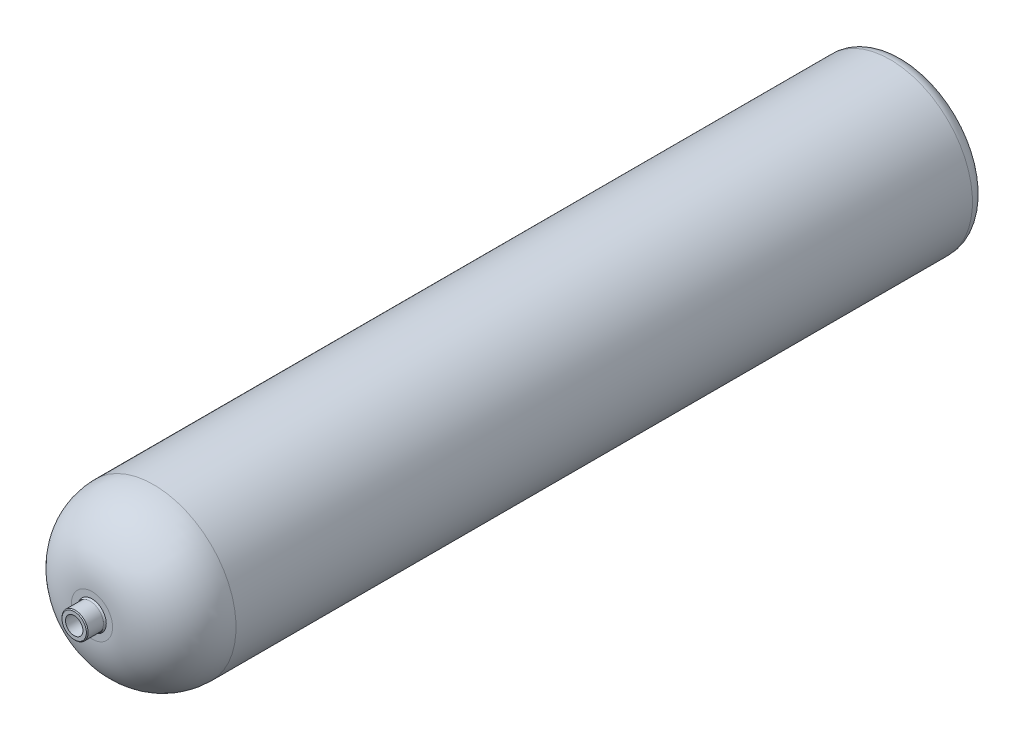
ISO-10303-21;
HEADER;
FILE_DESCRIPTION(('STEP AP214'),'2;1');
FILE_NAME('part.step','',(''),(''),'','','');
FILE_SCHEMA(('AUTOMOTIVE_DESIGN { 1 0 10303 214 1 1 1 1 }'));
ENDSEC;
DATA;
#1=APPLICATION_CONTEXT('core data for automotive mechanical design processes');
#2=APPLICATION_PROTOCOL_DEFINITION('international standard','automotive_design',2000,#1);
#3=PRODUCT_CONTEXT('',#1,'mechanical');
#4=PRODUCT('Part','Part','',(#3));
#5=PRODUCT_RELATED_PRODUCT_CATEGORY('part','',(#4));
#6=PRODUCT_DEFINITION_FORMATION('','',#4);
#7=PRODUCT_DEFINITION_CONTEXT('part definition',#1,'design');
#8=PRODUCT_DEFINITION('design','',#6,#7);
#9=PRODUCT_DEFINITION_SHAPE('','',#8);
#10=(LENGTH_UNIT() NAMED_UNIT(*) SI_UNIT(.MILLI.,.METRE.));
#11=(NAMED_UNIT(*) PLANE_ANGLE_UNIT() SI_UNIT($,.RADIAN.));
#12=(NAMED_UNIT(*) SI_UNIT($,.STERADIAN.) SOLID_ANGLE_UNIT());
#13=UNCERTAINTY_MEASURE_WITH_UNIT(LENGTH_MEASURE(1.E-05),#10,'distance_accuracy_value','');
#14=(GEOMETRIC_REPRESENTATION_CONTEXT(3) GLOBAL_UNCERTAINTY_ASSIGNED_CONTEXT((#13)) GLOBAL_UNIT_ASSIGNED_CONTEXT((#10,
#11,#12)) REPRESENTATION_CONTEXT('',''));
#15=CARTESIAN_POINT('',(0.,0.,0.));
#16=DIRECTION('',(0.,0.,1.));
#17=DIRECTION('',(1.,0.,0.));
#18=AXIS2_PLACEMENT_3D('',#15,#16,#17);
#19=CARTESIAN_POINT('',(0.,0.,329.65));
#20=DIRECTION('',(0.,0.,-1.));
#21=DIRECTION('',(-1.,0.,0.));
#22=AXIS2_PLACEMENT_3D('',#19,#20,#21);
#23=PLANE('',#22);
#24=CARTESIAN_POINT('',(0.,0.,329.65));
#25=DIRECTION('',(0.,0.,-1.));
#26=DIRECTION('',(-1.,0.,0.));
#27=AXIS2_PLACEMENT_3D('',#24,#25,#26);
#28=CIRCLE('',#27,30.);
#29=CARTESIAN_POINT('',(-30.,0.,329.65));
#30=VERTEX_POINT('',#29);
#31=EDGE_CURVE('E10',#30,#30,#28,.F.);
#32=ORIENTED_EDGE('',*,*,#31,.T.);
#33=EDGE_LOOP('',(#32));
#34=FACE_BOUND('',#33,.T.);
#35=CARTESIAN_POINT('',(0.,0.,329.65));
#36=DIRECTION('',(0.,0.,1.));
#37=DIRECTION('',(1.,0.,0.));
#38=AXIS2_PLACEMENT_3D('',#35,#36,#37);
#39=CIRCLE('',#38,20.7883652999684);
#40=CARTESIAN_POINT('',(20.7883652999684,0.,329.65));
#41=VERTEX_POINT('',#40);
#42=EDGE_CURVE('E54',#41,#41,#39,.F.);
#43=ORIENTED_EDGE('',*,*,#42,.T.);
#44=EDGE_LOOP('',(#43));
#45=FACE_BOUND('',#44,.T.);
#46=ADVANCED_FACE('F33',(#34,#45),#23,.F.);
#47=CARTESIAN_POINT('',(0.,0.,-854.));
#48=DIRECTION('',(0.,0.,1.));
#49=DIRECTION('',(1.,0.,0.));
#50=AXIS2_PLACEMENT_3D('',#47,#48,#49);
#51=CYLINDRICAL_SURFACE('',#50,120.);
#52=CARTESIAN_POINT('',(0.,0.,239.65));
#53=DIRECTION('',(0.,0.,-1.));
#54=DIRECTION('',(-1.,0.,0.));
#55=AXIS2_PLACEMENT_3D('',#52,#53,#54);
#56=CIRCLE('',#55,120.);
#57=CARTESIAN_POINT('',(-120.,0.,239.65));
#58=VERTEX_POINT('',#57);
#59=EDGE_CURVE('E40',#58,#58,#56,.T.);
#60=ORIENTED_EDGE('',*,*,#59,.T.);
#61=EDGE_LOOP('',(#60));
#62=FACE_BOUND('',#61,.T.);
#63=CARTESIAN_POINT('',(0.,0.,-834.));
#64=DIRECTION('',(0.,0.,-1.));
#65=DIRECTION('',(-1.,0.,0.));
#66=AXIS2_PLACEMENT_3D('',#63,#64,#65);
#67=CIRCLE('',#66,120.);
#68=CARTESIAN_POINT('',(-120.,0.,-834.));
#69=VERTEX_POINT('',#68);
#70=EDGE_CURVE('E44',#69,#69,#67,.F.);
#71=ORIENTED_EDGE('',*,*,#70,.T.);
#72=EDGE_LOOP('',(#71));
#73=FACE_BOUND('',#72,.T.);
#74=ADVANCED_FACE('F87',(#62,#73),#51,.T.);
#75=CARTESIAN_POINT('',(0.,0.,-854.));
#76=DIRECTION('',(0.,0.,-1.));
#77=DIRECTION('',(-1.,0.,0.));
#78=AXIS2_PLACEMENT_3D('',#75,#76,#77);
#79=PLANE('',#78);
#80=CARTESIAN_POINT('',(0.,0.,-854.));
#81=DIRECTION('',(0.,0.,-1.));
#82=DIRECTION('',(-1.,0.,0.));
#83=AXIS2_PLACEMENT_3D('',#80,#81,#82);
#84=CIRCLE('',#83,100.);
#85=CARTESIAN_POINT('',(-100.,0.,-854.));
#86=VERTEX_POINT('',#85);
#87=EDGE_CURVE('E48',#86,#86,#84,.T.);
#88=ORIENTED_EDGE('',*,*,#87,.T.);
#89=EDGE_LOOP('',(#88));
#90=FACE_BOUND('',#89,.T.);
#91=ADVANCED_FACE('F77',(#90),#79,.T.);
#92=CARTESIAN_POINT('',(0.,0.,330.2));
#93=DIRECTION('',(0.,0.,1.));
#94=DIRECTION('',(1.,0.,0.));
#95=AXIS2_PLACEMENT_3D('',#92,#93,#94);
#96=CYLINDRICAL_SURFACE('',#95,12.7);
#97=CARTESIAN_POINT('',(0.,0.,355.6));
#98=DIRECTION('',(0.,0.,1.));
#99=DIRECTION('',(1.,0.,0.));
#100=AXIS2_PLACEMENT_3D('',#97,#98,#99);
#101=CIRCLE('',#100,12.7);
#102=CARTESIAN_POINT('',(12.7,0.,355.6));
#103=VERTEX_POINT('',#102);
#104=EDGE_CURVE('E66',#103,#103,#101,.T.);
#105=ORIENTED_EDGE('',*,*,#104,.T.);
#106=EDGE_LOOP('',(#105));
#107=FACE_BOUND('',#106,.T.);
#108=CARTESIAN_POINT('',(0.,0.,329.65));
#109=DIRECTION('',(0.,0.,-1.));
#110=DIRECTION('',(-1.,0.,0.));
#111=AXIS2_PLACEMENT_3D('',#108,#109,#110);
#112=CIRCLE('',#111,12.7);
#113=CARTESIAN_POINT('',(-12.7,0.,329.65));
#114=VERTEX_POINT('',#113);
#115=EDGE_CURVE('E53',#114,#114,#112,.F.);
#116=ORIENTED_EDGE('',*,*,#115,.F.);
#117=EDGE_LOOP('',(#116));
#118=FACE_BOUND('',#117,.T.);
#119=ADVANCED_FACE('F74',(#107,#118),#96,.F.);
#120=CARTESIAN_POINT('',(0.,0.,332.060182940713));
#121=DIRECTION('',(0.,0.,-1.));
#122=DIRECTION('',(-1.,0.,0.));
#123=AXIS2_PLACEMENT_3D('',#120,#121,#122);
#124=TOROIDAL_SURFACE('',#123,21.59,2.54);
#125=CARTESIAN_POINT('',(0.,0.,332.060182940713));
#126=DIRECTION('',(0.,0.,-1.));
#127=DIRECTION('',(-1.,0.,0.));
#128=AXIS2_PLACEMENT_3D('',#125,#126,#127);
#129=CIRCLE('',#128,19.05);
#130=CARTESIAN_POINT('',(-19.05,0.,332.060182940713));
#131=VERTEX_POINT('',#130);
#132=EDGE_CURVE('E57',#131,#131,#129,.F.);
#133=ORIENTED_EDGE('',*,*,#132,.F.);
#134=EDGE_LOOP('',(#133));
#135=FACE_BOUND('',#134,.T.);
#136=ORIENTED_EDGE('',*,*,#42,.F.);
#137=EDGE_LOOP('',(#136));
#138=FACE_BOUND('',#137,.T.);
#139=ADVANCED_FACE('F76',(#135,#138),#124,.F.);
#140=CARTESIAN_POINT('',(0.,0.,355.6));
#141=DIRECTION('',(0.,0.,1.));
#142=DIRECTION('',(1.,0.,0.));
#143=AXIS2_PLACEMENT_3D('',#140,#141,#142);
#144=CYLINDRICAL_SURFACE('',#143,19.05);
#145=ORIENTED_EDGE('',*,*,#132,.T.);
#146=EDGE_LOOP('',(#145));
#147=FACE_BOUND('',#146,.T.);
#148=CARTESIAN_POINT('',(0.,0.,354.33));
#149=DIRECTION('',(0.,0.,1.));
#150=DIRECTION('',(1.,0.,0.));
#151=AXIS2_PLACEMENT_3D('',#148,#149,#150);
#152=CIRCLE('',#151,19.05);
#153=CARTESIAN_POINT('',(19.05,0.,354.33));
#154=VERTEX_POINT('',#153);
#155=EDGE_CURVE('E60',#154,#154,#152,.F.);
#156=ORIENTED_EDGE('',*,*,#155,.T.);
#157=EDGE_LOOP('',(#156));
#158=FACE_BOUND('',#157,.T.);
#159=ADVANCED_FACE('F84',(#147,#158),#144,.T.);
#160=CARTESIAN_POINT('',(0.,0.,355.6));
#161=DIRECTION('',(0.,0.,1.));
#162=DIRECTION('',(1.,0.,0.));
#163=AXIS2_PLACEMENT_3D('',#160,#161,#162);
#164=PLANE('',#163);
#165=CARTESIAN_POINT('',(0.,0.,355.6));
#166=DIRECTION('',(0.,0.,1.));
#167=DIRECTION('',(1.,0.,0.));
#168=AXIS2_PLACEMENT_3D('',#165,#166,#167);
#169=CIRCLE('',#168,17.78);
#170=CARTESIAN_POINT('',(17.78,0.,355.6));
#171=VERTEX_POINT('',#170);
#172=EDGE_CURVE('E63',#171,#171,#169,.T.);
#173=ORIENTED_EDGE('',*,*,#172,.T.);
#174=EDGE_LOOP('',(#173));
#175=FACE_BOUND('',#174,.T.);
#176=ORIENTED_EDGE('',*,*,#104,.F.);
#177=EDGE_LOOP('',(#176));
#178=FACE_BOUND('',#177,.T.);
#179=ADVANCED_FACE('F106',(#175,#178),#164,.T.);
#180=CARTESIAN_POINT('',(0.,0.,355.6));
#181=DIRECTION('',(0.,0.,-1.));
#182=DIRECTION('',(-1.,0.,0.));
#183=AXIS2_PLACEMENT_3D('',#180,#181,#182);
#184=CONICAL_SURFACE('',#183,17.78,0.785398163397422);
#185=ORIENTED_EDGE('',*,*,#155,.F.);
#186=EDGE_LOOP('',(#185));
#187=FACE_BOUND('',#186,.T.);
#188=ORIENTED_EDGE('',*,*,#172,.F.);
#189=EDGE_LOOP('',(#188));
#190=FACE_BOUND('',#189,.T.);
#191=ADVANCED_FACE('F100',(#187,#190),#184,.T.);
#192=ORIENTED_EDGE('',*,*,#115,.T.);
#193=EDGE_LOOP('',(#192));
#194=FACE_BOUND('',#193,.T.);
#195=ADVANCED_FACE('F72',(#194),#23,.F.);
#196=CARTESIAN_POINT('',(0.,0.,-834.));
#197=DIRECTION('',(0.,0.,-1.));
#198=DIRECTION('',(-1.,0.,0.));
#199=AXIS2_PLACEMENT_3D('',#196,#197,#198);
#200=TOROIDAL_SURFACE('',#199,100.,20.);
#201=ORIENTED_EDGE('',*,*,#70,.F.);
#202=EDGE_LOOP('',(#201));
#203=FACE_BOUND('',#202,.T.);
#204=ORIENTED_EDGE('',*,*,#87,.F.);
#205=EDGE_LOOP('',(#204));
#206=FACE_BOUND('',#205,.T.);
#207=ADVANCED_FACE('F99',(#203,#206),#200,.T.);
#208=CARTESIAN_POINT('',(0.,0.,239.65));
#209=DIRECTION('',(0.,0.,-1.));
#210=DIRECTION('',(-1.,0.,0.));
#211=AXIS2_PLACEMENT_3D('',#208,#209,#210);
#212=DEGENERATE_TOROIDAL_SURFACE('',#211,30.,90.,.T.);
#213=ORIENTED_EDGE('',*,*,#31,.F.);
#214=EDGE_LOOP('',(#213));
#215=FACE_BOUND('',#214,.T.);
#216=ORIENTED_EDGE('',*,*,#59,.F.);
#217=EDGE_LOOP('',(#216));
#218=FACE_BOUND('',#217,.T.);
#219=ADVANCED_FACE('F35',(#215,#218),#212,.T.);
#220=CLOSED_SHELL('',(#46,#74,#91,#119,#139,#159,#179,#191,#195,#207,#219));
#221=MANIFOLD_SOLID_BREP('B2',#220);
#222=ADVANCED_BREP_SHAPE_REPRESENTATION('',(#18,#221),#14);
#223=SHAPE_DEFINITION_REPRESENTATION(#9,#222);
ENDSEC;
END-ISO-10303-21;
